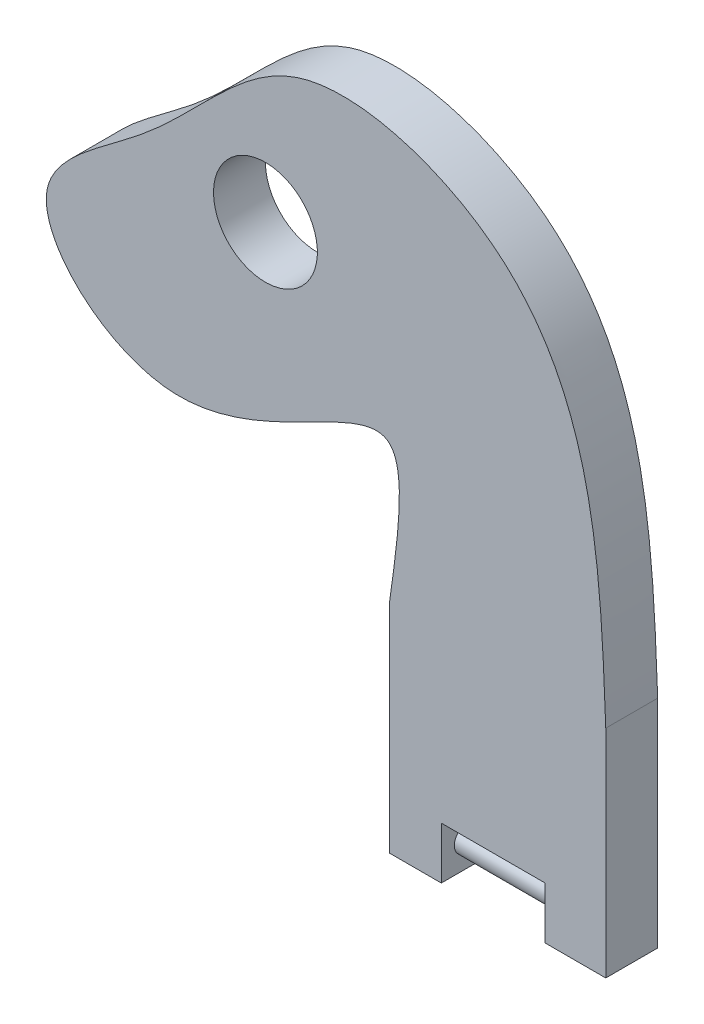
ISO-10303-21;
HEADER;
FILE_DESCRIPTION(('STEP AP214'),'2;1');
FILE_NAME('part.step','',(''),(''),'','','');
FILE_SCHEMA(('AUTOMOTIVE_DESIGN { 1 0 10303 214 1 1 1 1 }'));
ENDSEC;
DATA;
#1=APPLICATION_CONTEXT('core data for automotive mechanical design processes');
#2=APPLICATION_PROTOCOL_DEFINITION('international standard','automotive_design',2000,#1);
#3=PRODUCT_CONTEXT('',#1,'mechanical');
#4=PRODUCT('Part','Part','',(#3));
#5=PRODUCT_RELATED_PRODUCT_CATEGORY('part','',(#4));
#6=PRODUCT_DEFINITION_FORMATION('','',#4);
#7=PRODUCT_DEFINITION_CONTEXT('part definition',#1,'design');
#8=PRODUCT_DEFINITION('design','',#6,#7);
#9=PRODUCT_DEFINITION_SHAPE('','',#8);
#10=(LENGTH_UNIT() NAMED_UNIT(*) SI_UNIT(.MILLI.,.METRE.));
#11=(NAMED_UNIT(*) PLANE_ANGLE_UNIT() SI_UNIT($,.RADIAN.));
#12=(NAMED_UNIT(*) SI_UNIT($,.STERADIAN.) SOLID_ANGLE_UNIT());
#13=UNCERTAINTY_MEASURE_WITH_UNIT(LENGTH_MEASURE(1.E-05),#10,'distance_accuracy_value','');
#14=(GEOMETRIC_REPRESENTATION_CONTEXT(3) GLOBAL_UNCERTAINTY_ASSIGNED_CONTEXT((#13)) GLOBAL_UNIT_ASSIGNED_CONTEXT((#10,
#11,#12)) REPRESENTATION_CONTEXT('',''));
#15=CARTESIAN_POINT('',(0.,0.,0.));
#16=DIRECTION('',(0.,0.,1.));
#17=DIRECTION('',(1.,0.,0.));
#18=AXIS2_PLACEMENT_3D('',#15,#16,#17);
#19=CARTESIAN_POINT('',(-0.176533916054197,-24.9241285525186,6.));
#20=DIRECTION('',(0.,1.,0.));
#21=DIRECTION('',(0.,0.,1.));
#22=AXIS2_PLACEMENT_3D('',#19,#20,#21);
#23=PLANE('',#22);
#24=DIRECTION('',(0.,0.,1.));
#25=VECTOR('',#24,1.);
#26=CARTESIAN_POINT('',(-7.17653391605419,-24.9241285525186,-4.));
#27=LINE('',#26,#25);
#28=CARTESIAN_POINT('',(-7.17653391605419,-24.9241285525186,0.));
#29=VERTEX_POINT('',#28);
#30=CARTESIAN_POINT('',(-7.17653391605419,-24.9241285525186,6.));
#31=VERTEX_POINT('',#30);
#32=EDGE_CURVE('E141',#29,#31,#27,.T.);
#33=ORIENTED_EDGE('',*,*,#32,.F.);
#34=DIRECTION('',(1.,0.,0.));
#35=VECTOR('',#34,1.);
#36=CARTESIAN_POINT('',(-0.176533916054197,-24.9241285525186,0.));
#37=LINE('',#36,#35);
#38=CARTESIAN_POINT('',(-0.176533916054197,-24.9241285525186,0.));
#39=VERTEX_POINT('',#38);
#40=EDGE_CURVE('E166',#29,#39,#37,.T.);
#41=ORIENTED_EDGE('',*,*,#40,.T.);
#42=DIRECTION('',(0.,0.,-1.));
#43=VECTOR('',#42,1.);
#44=CARTESIAN_POINT('',(-0.176533916054197,-24.9241285525186,6.));
#45=LINE('',#44,#43);
#46=CARTESIAN_POINT('',(-0.176533916054197,-24.9241285525186,6.));
#47=VERTEX_POINT('',#46);
#48=EDGE_CURVE('E180',#47,#39,#45,.T.);
#49=ORIENTED_EDGE('',*,*,#48,.F.);
#50=DIRECTION('',(1.,0.,0.));
#51=VECTOR('',#50,1.);
#52=CARTESIAN_POINT('',(-0.176533916054197,-24.9241285525186,6.));
#53=LINE('',#52,#51);
#54=EDGE_CURVE('E146',#31,#47,#53,.T.);
#55=ORIENTED_EDGE('',*,*,#54,.F.);
#56=EDGE_LOOP('',(#33,#41,#49,#55));
#57=FACE_BOUND('',#56,.T.);
#58=ADVANCED_FACE('F44',(#57),#23,.F.);
#59=CARTESIAN_POINT('',(-48.4746176802483,37.5936588865872,6.));
#60=DIRECTION('',(0.,0.,-1.));
#61=DIRECTION('',(-1.,0.,0.));
#62=AXIS2_PLACEMENT_3D('',#59,#60,#61);
#63=PLANE('',#62);
#64=CARTESIAN_POINT('',(-39.4974486724649,31.0299399444295,6.));
#65=DIRECTION('',(0.,0.,1.));
#66=DIRECTION('',(-1.,0.,0.));
#67=AXIS2_PLACEMENT_3D('',#64,#65,#66);
#68=CIRCLE('',#67,6.);
#69=CARTESIAN_POINT('',(-45.4974486724649,31.0299399444295,6.));
#70=VERTEX_POINT('',#69);
#71=EDGE_CURVE('E162',#70,#70,#68,.T.);
#72=ORIENTED_EDGE('',*,*,#71,.F.);
#73=EDGE_LOOP('',(#72));
#74=FACE_BOUND('',#73,.T.);
#75=DIRECTION('',(0.,-1.,0.));
#76=VECTOR('',#75,1.);
#77=CARTESIAN_POINT('',(-19.1765339160542,-24.9241285525186,6.));
#78=LINE('',#77,#76);
#79=CARTESIAN_POINT('',(-19.1765339160542,-18.9241285525186,6.));
#80=VERTEX_POINT('',#79);
#81=CARTESIAN_POINT('',(-19.1765339160542,-24.9241285525186,6.));
#82=VERTEX_POINT('',#81);
#83=EDGE_CURVE('E123',#80,#82,#78,.T.);
#84=ORIENTED_EDGE('',*,*,#83,.F.);
#85=DIRECTION('',(-1.,0.,0.));
#86=VECTOR('',#85,1.);
#87=CARTESIAN_POINT('',(-19.1765339160542,-18.9241285525186,6.));
#88=LINE('',#87,#86);
#89=CARTESIAN_POINT('',(-7.17653391605419,-18.9241285525186,6.));
#90=VERTEX_POINT('',#89);
#91=EDGE_CURVE('E145',#90,#80,#88,.T.);
#92=ORIENTED_EDGE('',*,*,#91,.F.);
#93=DIRECTION('',(0.,1.,0.));
#94=VECTOR('',#93,1.);
#95=CARTESIAN_POINT('',(-7.17653391605419,-24.9241285525186,6.));
#96=LINE('',#95,#94);
#97=EDGE_CURVE('E134',#31,#90,#96,.T.);
#98=ORIENTED_EDGE('',*,*,#97,.F.);
#99=ORIENTED_EDGE('',*,*,#54,.T.);
#100=DIRECTION('',(0.,1.,0.));
#101=VECTOR('',#100,1.);
#102=CARTESIAN_POINT('',(-0.176533916054197,0.0758714474813904,6.));
#103=LINE('',#102,#101);
#104=CARTESIAN_POINT('',(-0.176533916054197,0.0758714474813904,6.));
#105=VERTEX_POINT('',#104);
#106=EDGE_CURVE('E72',#47,#105,#103,.T.);
#107=ORIENTED_EDGE('',*,*,#106,.T.);
#108=CARTESIAN_POINT('',(-0.176533916054197,0.0758714474813836,6.));
#109=CARTESIAN_POINT('',(-0.818277964641801,16.4328608221011,6.));
#110=CARTESIAN_POINT('',(-1.78881754529718,41.1703019302296,6.));
#111=CARTESIAN_POINT('',(-37.9229317823738,52.3710222954656,6.));
#112=CARTESIAN_POINT('',(-49.6926536110426,33.7594827328948,6.));
#113=CARTESIAN_POINT('',(-71.3263717973194,21.6944290534621,6.));
#114=CARTESIAN_POINT('',(-48.1677412187407,-0.161154951670683,6.));
#115=CARTESIAN_POINT('',(-21.5314296873413,25.9053625864042,6.));
#116=CARTESIAN_POINT('',(-24.1777906765351,7.15304346687418,6.));
#117=CARTESIAN_POINT('',(-25.1765339160542,0.0758714474813896,6.));
#118=B_SPLINE_CURVE_WITH_KNOTS('',3,(#108,#109,#110,#111,#112,#113,#114,#115,#116,#117),
.UNSPECIFIED.,.F.,.F.,(4,1,1,1,1,1,1,4),(0.,0.261746225134487,0.395851075112034,
0.538841490244459,0.633580309024336,0.747023207807481,0.904525927494695,1.),.UNSPECIFIED.);
#119=CARTESIAN_POINT('',(-25.1765339160542,0.0758714474813904,6.));
#120=VERTEX_POINT('',#119);
#121=EDGE_CURVE('E175',#105,#120,#118,.T.);
#122=ORIENTED_EDGE('',*,*,#121,.T.);
#123=DIRECTION('',(0.,-1.,0.));
#124=VECTOR('',#123,1.);
#125=CARTESIAN_POINT('',(-25.1765339160542,-24.9241285525186,6.));
#126=LINE('',#125,#124);
#127=CARTESIAN_POINT('',(-25.1765339160542,-24.9241285525186,6.));
#128=VERTEX_POINT('',#127);
#129=EDGE_CURVE('E99',#120,#128,#126,.T.);
#130=ORIENTED_EDGE('',*,*,#129,.T.);
#131=EDGE_CURVE('E139',#128,#82,#53,.T.);
#132=ORIENTED_EDGE('',*,*,#131,.T.);
#133=EDGE_LOOP('',(#84,#92,#98,#99,#107,#122,#130,#132));
#134=FACE_BOUND('',#133,.T.);
#135=ADVANCED_FACE('F148',(#74,#134),#63,.F.);
#136=CARTESIAN_POINT('',(-48.4746176802483,37.5936588865872,0.));
#137=DIRECTION('',(0.,0.,-1.));
#138=DIRECTION('',(-1.,0.,0.));
#139=AXIS2_PLACEMENT_3D('',#136,#137,#138);
#140=PLANE('',#139);
#141=DIRECTION('',(0.,1.,0.));
#142=VECTOR('',#141,1.);
#143=CARTESIAN_POINT('',(-19.1765339160542,37.5936588865872,0.));
#144=LINE('',#143,#142);
#145=CARTESIAN_POINT('',(-19.1765339160542,-24.9241285525186,0.));
#146=VERTEX_POINT('',#145);
#147=CARTESIAN_POINT('',(-19.1765339160542,-18.9241285525186,0.));
#148=VERTEX_POINT('',#147);
#149=EDGE_CURVE('E195',#146,#148,#144,.T.);
#150=ORIENTED_EDGE('',*,*,#149,.F.);
#151=CARTESIAN_POINT('',(-25.1765339160542,-24.9241285525186,0.));
#152=VERTEX_POINT('',#151);
#153=EDGE_CURVE('E143',#152,#146,#37,.T.);
#154=ORIENTED_EDGE('',*,*,#153,.F.);
#155=DIRECTION('',(0.,-1.,0.));
#156=VECTOR('',#155,1.);
#157=CARTESIAN_POINT('',(-25.1765339160542,-24.9241285525186,0.));
#158=LINE('',#157,#156);
#159=CARTESIAN_POINT('',(-25.1765339160542,0.0758714474813904,0.));
#160=VERTEX_POINT('',#159);
#161=EDGE_CURVE('E165',#160,#152,#158,.T.);
#162=ORIENTED_EDGE('',*,*,#161,.F.);
#163=CARTESIAN_POINT('',(-0.176533916054197,0.0758714474813836,0.));
#164=CARTESIAN_POINT('',(-0.818277964641801,16.4328608221011,0.));
#165=CARTESIAN_POINT('',(-1.78881754529718,41.1703019302296,0.));
#166=CARTESIAN_POINT('',(-37.9229317823738,52.3710222954656,0.));
#167=CARTESIAN_POINT('',(-49.6926536110426,33.7594827328948,0.));
#168=CARTESIAN_POINT('',(-71.3263717973194,21.6944290534621,0.));
#169=CARTESIAN_POINT('',(-48.1677412187407,-0.161154951670683,0.));
#170=CARTESIAN_POINT('',(-21.5314296873413,25.9053625864042,0.));
#171=CARTESIAN_POINT('',(-24.1777906765351,7.15304346687418,0.));
#172=CARTESIAN_POINT('',(-25.1765339160542,0.0758714474813896,0.));
#173=B_SPLINE_CURVE_WITH_KNOTS('',3,(#163,#164,#165,#166,#167,#168,#169,#170,#171,#172),
.UNSPECIFIED.,.F.,.F.,(4,1,1,1,1,1,1,4),(0.,0.261746225134487,0.395851075112034,
0.538841490244459,0.633580309024336,0.747023207807481,0.904525927494695,1.),.UNSPECIFIED.);
#174=CARTESIAN_POINT('',(-0.176533916054197,0.0758714474813904,0.));
#175=VERTEX_POINT('',#174);
#176=EDGE_CURVE('E156',#175,#160,#173,.T.);
#177=ORIENTED_EDGE('',*,*,#176,.F.);
#178=DIRECTION('',(0.,1.,0.));
#179=VECTOR('',#178,1.);
#180=CARTESIAN_POINT('',(-0.176533916054197,0.0758714474813904,0.));
#181=LINE('',#180,#179);
#182=EDGE_CURVE('E95',#39,#175,#181,.T.);
#183=ORIENTED_EDGE('',*,*,#182,.F.);
#184=ORIENTED_EDGE('',*,*,#40,.F.);
#185=DIRECTION('',(0.,-1.,0.));
#186=VECTOR('',#185,1.);
#187=CARTESIAN_POINT('',(-7.17653391605419,37.5936588865872,0.));
#188=LINE('',#187,#186);
#189=CARTESIAN_POINT('',(-7.17653391605419,-18.9241285525186,0.));
#190=VERTEX_POINT('',#189);
#191=EDGE_CURVE('E188',#190,#29,#188,.T.);
#192=ORIENTED_EDGE('',*,*,#191,.F.);
#193=DIRECTION('',(1.,0.,0.));
#194=VECTOR('',#193,1.);
#195=CARTESIAN_POINT('',(-48.4746176802483,-18.9241285525186,0.));
#196=LINE('',#195,#194);
#197=EDGE_CURVE('E190',#148,#190,#196,.T.);
#198=ORIENTED_EDGE('',*,*,#197,.F.);
#199=EDGE_LOOP('',(#150,#154,#162,#177,#183,#184,#192,#198));
#200=FACE_BOUND('',#199,.T.);
#201=CARTESIAN_POINT('',(-39.4974486724649,31.0299399444295,0.));
#202=DIRECTION('',(0.,0.,1.));
#203=DIRECTION('',(-1.,0.,0.));
#204=AXIS2_PLACEMENT_3D('',#201,#202,#203);
#205=CIRCLE('',#204,6.);
#206=CARTESIAN_POINT('',(-45.4974486724649,31.0299399444295,0.));
#207=VERTEX_POINT('',#206);
#208=EDGE_CURVE('E224',#207,#207,#205,.T.);
#209=ORIENTED_EDGE('',*,*,#208,.T.);
#210=EDGE_LOOP('',(#209));
#211=FACE_BOUND('',#210,.T.);
#212=ADVANCED_FACE('F216',(#200,#211),#140,.T.);
#213=DIRECTION('',(0.,0.,-1.));
#214=VECTOR('',#213,1.);
#215=SURFACE_OF_LINEAR_EXTRUSION('',#118,#214);
#216=ORIENTED_EDGE('',*,*,#176,.T.);
#217=DIRECTION('',(0.,0.,-1.));
#218=VECTOR('',#217,1.);
#219=CARTESIAN_POINT('',(-25.1765339160542,0.0758714474813904,6.));
#220=LINE('',#219,#218);
#221=EDGE_CURVE('E181',#120,#160,#220,.T.);
#222=ORIENTED_EDGE('',*,*,#221,.F.);
#223=ORIENTED_EDGE('',*,*,#121,.F.);
#224=DIRECTION('',(0.,0.,-1.));
#225=VECTOR('',#224,1.);
#226=CARTESIAN_POINT('',(-0.176533916054197,0.0758714474813904,6.));
#227=LINE('',#226,#225);
#228=EDGE_CURVE('E155',#105,#175,#227,.T.);
#229=ORIENTED_EDGE('',*,*,#228,.T.);
#230=EDGE_LOOP('',(#216,#222,#223,#229));
#231=FACE_BOUND('',#230,.T.);
#232=ADVANCED_FACE('F50',(#231),#215,.F.);
#233=CARTESIAN_POINT('',(-25.1765339160542,-24.9241285525186,6.));
#234=DIRECTION('',(1.,0.,0.));
#235=DIRECTION('',(0.,0.,-1.));
#236=AXIS2_PLACEMENT_3D('',#233,#234,#235);
#237=PLANE('',#236);
#238=ORIENTED_EDGE('',*,*,#161,.T.);
#239=DIRECTION('',(0.,0.,-1.));
#240=VECTOR('',#239,1.);
#241=CARTESIAN_POINT('',(-25.1765339160542,-24.9241285525186,6.));
#242=LINE('',#241,#240);
#243=EDGE_CURVE('E177',#128,#152,#242,.T.);
#244=ORIENTED_EDGE('',*,*,#243,.F.);
#245=ORIENTED_EDGE('',*,*,#129,.F.);
#246=ORIENTED_EDGE('',*,*,#221,.T.);
#247=EDGE_LOOP('',(#238,#244,#245,#246));
#248=FACE_BOUND('',#247,.T.);
#249=ADVANCED_FACE('F248',(#248),#237,.F.);
#250=ORIENTED_EDGE('',*,*,#153,.T.);
#251=DIRECTION('',(0.,0.,1.));
#252=VECTOR('',#251,1.);
#253=CARTESIAN_POINT('',(-19.1765339160542,-24.9241285525186,-4.));
#254=LINE('',#253,#252);
#255=EDGE_CURVE('E124',#146,#82,#254,.T.);
#256=ORIENTED_EDGE('',*,*,#255,.T.);
#257=ORIENTED_EDGE('',*,*,#131,.F.);
#258=ORIENTED_EDGE('',*,*,#243,.T.);
#259=EDGE_LOOP('',(#250,#256,#257,#258));
#260=FACE_BOUND('',#259,.T.);
#261=ADVANCED_FACE('F140',(#260),#23,.F.);
#262=CARTESIAN_POINT('',(-0.176533916054197,0.0758714474813904,6.));
#263=DIRECTION('',(-1.,0.,0.));
#264=DIRECTION('',(0.,0.,1.));
#265=AXIS2_PLACEMENT_3D('',#262,#263,#264);
#266=PLANE('',#265);
#267=ORIENTED_EDGE('',*,*,#182,.T.);
#268=ORIENTED_EDGE('',*,*,#228,.F.);
#269=ORIENTED_EDGE('',*,*,#106,.F.);
#270=ORIENTED_EDGE('',*,*,#48,.T.);
#271=EDGE_LOOP('',(#267,#268,#269,#270));
#272=FACE_BOUND('',#271,.T.);
#273=ADVANCED_FACE('F246',(#272),#266,.F.);
#274=CARTESIAN_POINT('',(-39.4974486724649,31.0299399444295,6.));
#275=DIRECTION('',(0.,0.,-1.));
#276=DIRECTION('',(-1.,0.,0.));
#277=AXIS2_PLACEMENT_3D('',#274,#275,#276);
#278=CYLINDRICAL_SURFACE('',#277,6.);
#279=ORIENTED_EDGE('',*,*,#71,.T.);
#280=EDGE_LOOP('',(#279));
#281=FACE_BOUND('',#280,.T.);
#282=ORIENTED_EDGE('',*,*,#208,.F.);
#283=EDGE_LOOP('',(#282));
#284=FACE_BOUND('',#283,.T.);
#285=ADVANCED_FACE('F247',(#281,#284),#278,.F.);
#286=CARTESIAN_POINT('',(-19.1765339160542,-24.9241285525186,-4.));
#287=DIRECTION('',(-1.,0.,0.));
#288=DIRECTION('',(0.,0.,1.));
#289=AXIS2_PLACEMENT_3D('',#286,#287,#288);
#290=PLANE('',#289);
#291=CARTESIAN_POINT('',(-19.1765339160542,-21.9241285525186,3.));
#292=DIRECTION('',(-1.,0.,0.));
#293=DIRECTION('',(0.,0.,1.));
#294=AXIS2_PLACEMENT_3D('',#291,#292,#293);
#295=CIRCLE('',#294,1.5);
#296=CARTESIAN_POINT('',(-19.1765339160542,-21.9241285525186,1.5));
#297=VERTEX_POINT('',#296);
#298=EDGE_CURVE('E11',#297,#297,#295,.F.);
#299=ORIENTED_EDGE('',*,*,#298,.F.);
#300=EDGE_LOOP('',(#299));
#301=FACE_BOUND('',#300,.T.);
#302=ORIENTED_EDGE('',*,*,#149,.T.);
#303=DIRECTION('',(0.,0.,1.));
#304=VECTOR('',#303,1.);
#305=CARTESIAN_POINT('',(-19.1765339160542,-18.9241285525186,-4.));
#306=LINE('',#305,#304);
#307=EDGE_CURVE('E130',#148,#80,#306,.T.);
#308=ORIENTED_EDGE('',*,*,#307,.T.);
#309=ORIENTED_EDGE('',*,*,#83,.T.);
#310=ORIENTED_EDGE('',*,*,#255,.F.);
#311=EDGE_LOOP('',(#302,#308,#309,#310));
#312=FACE_BOUND('',#311,.T.);
#313=ADVANCED_FACE('F121',(#301,#312),#290,.F.);
#314=CARTESIAN_POINT('',(-19.1765339160542,-18.9241285525186,-4.));
#315=DIRECTION('',(0.,1.,0.));
#316=DIRECTION('',(0.,0.,1.));
#317=AXIS2_PLACEMENT_3D('',#314,#315,#316);
#318=PLANE('',#317);
#319=ORIENTED_EDGE('',*,*,#197,.T.);
#320=DIRECTION('',(0.,0.,1.));
#321=VECTOR('',#320,1.);
#322=CARTESIAN_POINT('',(-7.17653391605419,-18.9241285525186,-4.));
#323=LINE('',#322,#321);
#324=EDGE_CURVE('E64',#190,#90,#323,.T.);
#325=ORIENTED_EDGE('',*,*,#324,.T.);
#326=ORIENTED_EDGE('',*,*,#91,.T.);
#327=ORIENTED_EDGE('',*,*,#307,.F.);
#328=EDGE_LOOP('',(#319,#325,#326,#327));
#329=FACE_BOUND('',#328,.T.);
#330=ADVANCED_FACE('F201',(#329),#318,.F.);
#331=CARTESIAN_POINT('',(-7.17653391605419,-24.9241285525186,-4.));
#332=DIRECTION('',(1.,0.,0.));
#333=DIRECTION('',(0.,0.,-1.));
#334=AXIS2_PLACEMENT_3D('',#331,#332,#333);
#335=PLANE('',#334);
#336=CARTESIAN_POINT('',(-7.17653391605419,-21.9241285525186,3.));
#337=DIRECTION('',(1.,0.,0.));
#338=DIRECTION('',(0.,0.,-1.));
#339=AXIS2_PLACEMENT_3D('',#336,#337,#338);
#340=CIRCLE('',#339,1.5);
#341=CARTESIAN_POINT('',(-7.1765339160542,-21.9241285525186,1.5));
#342=VERTEX_POINT('',#341);
#343=EDGE_CURVE('E54',#342,#342,#340,.F.);
#344=ORIENTED_EDGE('',*,*,#343,.F.);
#345=EDGE_LOOP('',(#344));
#346=FACE_BOUND('',#345,.T.);
#347=ORIENTED_EDGE('',*,*,#191,.T.);
#348=ORIENTED_EDGE('',*,*,#32,.T.);
#349=ORIENTED_EDGE('',*,*,#97,.T.);
#350=ORIENTED_EDGE('',*,*,#324,.F.);
#351=EDGE_LOOP('',(#347,#348,#349,#350));
#352=FACE_BOUND('',#351,.T.);
#353=ADVANCED_FACE('F203',(#346,#352),#335,.F.);
#354=CARTESIAN_POINT('',(-64.8182939631733,-21.9241285525186,3.));
#355=DIRECTION('',(1.,0.,0.));
#356=DIRECTION('',(0.,0.,-1.));
#357=AXIS2_PLACEMENT_3D('',#354,#355,#356);
#358=CYLINDRICAL_SURFACE('',#357,1.5);
#359=CARTESIAN_POINT('',(-7.1765339160542,-21.9241285525186,1.5));
#360=CARTESIAN_POINT('',(-7.3015339160542,-21.9241285525186,1.5));
#361=CARTESIAN_POINT('',(-7.4265339160542,-21.9241285525186,1.5));
#362=CARTESIAN_POINT('',(-7.6765339160542,-21.9241285525186,1.5));
#363=CARTESIAN_POINT('',(-7.8015339160542,-21.9241285525186,1.5));
#364=CARTESIAN_POINT('',(-8.0515339160542,-21.9241285525186,1.5));
#365=CARTESIAN_POINT('',(-8.1765339160542,-21.9241285525186,1.5));
#366=CARTESIAN_POINT('',(-8.4265339160542,-21.9241285525186,1.5));
#367=CARTESIAN_POINT('',(-8.5515339160542,-21.9241285525186,1.5));
#368=CARTESIAN_POINT('',(-8.8015339160542,-21.9241285525186,1.5));
#369=CARTESIAN_POINT('',(-8.9265339160542,-21.9241285525186,1.5));
#370=CARTESIAN_POINT('',(-9.1765339160542,-21.9241285525186,1.5));
#371=CARTESIAN_POINT('',(-9.3015339160542,-21.9241285525186,1.5));
#372=CARTESIAN_POINT('',(-9.5515339160542,-21.9241285525186,1.5));
#373=CARTESIAN_POINT('',(-9.6765339160542,-21.9241285525186,1.5));
#374=CARTESIAN_POINT('',(-9.9265339160542,-21.9241285525186,1.5));
#375=CARTESIAN_POINT('',(-10.0515339160542,-21.9241285525186,1.5));
#376=CARTESIAN_POINT('',(-10.3015339160542,-21.9241285525186,1.5));
#377=CARTESIAN_POINT('',(-10.4265339160542,-21.9241285525186,1.5));
#378=CARTESIAN_POINT('',(-10.6765339160542,-21.9241285525186,1.5));
#379=CARTESIAN_POINT('',(-10.8015339160542,-21.9241285525186,1.5));
#380=CARTESIAN_POINT('',(-11.0515339160542,-21.9241285525186,1.5));
#381=CARTESIAN_POINT('',(-11.1765339160542,-21.9241285525186,1.5));
#382=CARTESIAN_POINT('',(-11.4265339160542,-21.9241285525186,1.5));
#383=CARTESIAN_POINT('',(-11.5515339160542,-21.9241285525186,1.5));
#384=CARTESIAN_POINT('',(-11.8015339160542,-21.9241285525186,1.5));
#385=CARTESIAN_POINT('',(-11.9265339160542,-21.9241285525186,1.5));
#386=CARTESIAN_POINT('',(-12.1765339160542,-21.9241285525186,1.5));
#387=CARTESIAN_POINT('',(-12.3015339160542,-21.9241285525186,1.5));
#388=CARTESIAN_POINT('',(-12.5515339160542,-21.9241285525186,1.5));
#389=CARTESIAN_POINT('',(-12.6765339160542,-21.9241285525186,1.5));
#390=CARTESIAN_POINT('',(-12.9265339160542,-21.9241285525186,1.5));
#391=CARTESIAN_POINT('',(-13.0515339160542,-21.9241285525186,1.5));
#392=CARTESIAN_POINT('',(-13.3015339160542,-21.9241285525186,1.5));
#393=CARTESIAN_POINT('',(-13.4265339160542,-21.9241285525186,1.5));
#394=CARTESIAN_POINT('',(-13.6765339160542,-21.9241285525186,1.5));
#395=CARTESIAN_POINT('',(-13.8015339160542,-21.9241285525186,1.5));
#396=CARTESIAN_POINT('',(-14.0515339160542,-21.9241285525186,1.5));
#397=CARTESIAN_POINT('',(-14.1765339160542,-21.9241285525186,1.5));
#398=CARTESIAN_POINT('',(-14.4265339160542,-21.9241285525186,1.5));
#399=CARTESIAN_POINT('',(-14.5515339160542,-21.9241285525186,1.5));
#400=CARTESIAN_POINT('',(-14.8015339160542,-21.9241285525186,1.5));
#401=CARTESIAN_POINT('',(-14.9265339160542,-21.9241285525186,1.5));
#402=CARTESIAN_POINT('',(-15.1765339160542,-21.9241285525186,1.5));
#403=CARTESIAN_POINT('',(-15.3015339160542,-21.9241285525186,1.5));
#404=CARTESIAN_POINT('',(-15.5515339160542,-21.9241285525186,1.5));
#405=CARTESIAN_POINT('',(-15.6765339160542,-21.9241285525186,1.5));
#406=CARTESIAN_POINT('',(-15.9265339160542,-21.9241285525186,1.5));
#407=CARTESIAN_POINT('',(-16.0515339160542,-21.9241285525186,1.5));
#408=CARTESIAN_POINT('',(-16.3015339160542,-21.9241285525186,1.5));
#409=CARTESIAN_POINT('',(-16.4265339160542,-21.9241285525186,1.5));
#410=CARTESIAN_POINT('',(-16.6765339160542,-21.9241285525186,1.5));
#411=CARTESIAN_POINT('',(-16.8015339160542,-21.9241285525186,1.5));
#412=CARTESIAN_POINT('',(-17.0515339160542,-21.9241285525186,1.5));
#413=CARTESIAN_POINT('',(-17.1765339160542,-21.9241285525186,1.5));
#414=CARTESIAN_POINT('',(-17.4265339160542,-21.9241285525186,1.5));
#415=CARTESIAN_POINT('',(-17.5515339160542,-21.9241285525186,1.5));
#416=CARTESIAN_POINT('',(-17.8015339160542,-21.9241285525186,1.5));
#417=CARTESIAN_POINT('',(-17.9265339160542,-21.9241285525186,1.5));
#418=CARTESIAN_POINT('',(-18.1765339160542,-21.9241285525186,1.5));
#419=CARTESIAN_POINT('',(-18.3015339160542,-21.9241285525186,1.5));
#420=CARTESIAN_POINT('',(-18.5515339160542,-21.9241285525186,1.5));
#421=CARTESIAN_POINT('',(-18.6765339160542,-21.9241285525186,1.5));
#422=CARTESIAN_POINT('',(-18.9265339160542,-21.9241285525186,1.5));
#423=CARTESIAN_POINT('',(-19.0515339160542,-21.9241285525186,1.5));
#424=CARTESIAN_POINT('',(-19.1765339160542,-21.9241285525186,1.5));
#425=B_SPLINE_CURVE_WITH_KNOTS('',3,(#359,#360,#361,#362,#363,#364,#365,#366,#367,#368,#369,
#370,#371,#372,#373,#374,#375,#376,#377,#378,#379,#380,#381,#382,#383,#384,#385,#386,#387,#388,
#389,#390,#391,#392,#393,#394,#395,#396,#397,#398,#399,#400,#401,#402,#403,#404,#405,#406,#407,
#408,#409,#410,#411,#412,#413,#414,#415,#416,#417,#418,#419,#420,#421,#422,#423,#424),
.UNSPECIFIED.,.F.,.F.,(4,2,2,2,2,2,2,2,2,2,2,2,2,2,2,2,2,2,2,2,2,2,2,2,2,2,2,2,2,2,2,2,4),(0.,
0.375,0.750000000000001,1.125,1.5,1.875,2.25,2.625,3.,3.375,3.75,4.125,4.5,4.875,5.25,5.625,6.,
6.375,6.75,7.125,7.5,7.875,8.24999999999999,8.62499999999999,8.99999999999999,9.37499999999999,
9.74999999999999,10.125,10.5,10.875,11.25,11.625,12.),.UNSPECIFIED.);
#426=EDGE_CURVE('BSEAM196',#342,#297,#425,.T.);
#427=ORIENTED_EDGE('',*,*,#343,.T.);
#428=ORIENTED_EDGE('',*,*,#298,.T.);
#429=ORIENTED_EDGE('',*,*,#426,.T.);
#430=ORIENTED_EDGE('',*,*,#426,.F.);
#431=EDGE_LOOP('',(#427,#429,#428,#430));
#432=FACE_BOUND('',#431,.T.);
#433=ADVANCED_FACE('F196',(#432),#358,.T.);
#434=CLOSED_SHELL('',(#58,#135,#212,#232,#249,#261,#273,#285,#313,#330,#353,#433));
#435=MANIFOLD_SOLID_BREP('B2',#434);
#436=ADVANCED_BREP_SHAPE_REPRESENTATION('',(#18,#435),#14);
#437=SHAPE_DEFINITION_REPRESENTATION(#9,#436);
ENDSEC;
END-ISO-10303-21;
